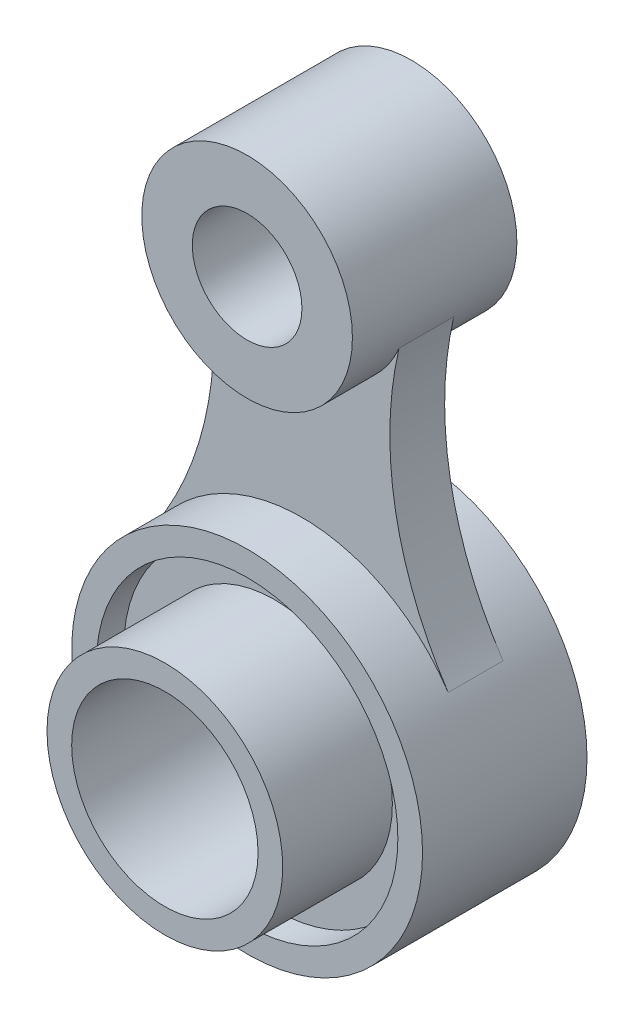
ISO-10303-21;
HEADER;
FILE_DESCRIPTION(('STEP AP214'),'2;1');
FILE_NAME('part.step','',(''),(''),'','','');
FILE_SCHEMA(('AUTOMOTIVE_DESIGN { 1 0 10303 214 1 1 1 1 }'));
ENDSEC;
DATA;
#1=APPLICATION_CONTEXT('core data for automotive mechanical design processes');
#2=APPLICATION_PROTOCOL_DEFINITION('international standard','automotive_design',2000,#1);
#3=PRODUCT_CONTEXT('',#1,'mechanical');
#4=PRODUCT('Part','Part','',(#3));
#5=PRODUCT_RELATED_PRODUCT_CATEGORY('part','',(#4));
#6=PRODUCT_DEFINITION_FORMATION('','',#4);
#7=PRODUCT_DEFINITION_CONTEXT('part definition',#1,'design');
#8=PRODUCT_DEFINITION('design','',#6,#7);
#9=PRODUCT_DEFINITION_SHAPE('','',#8);
#10=(LENGTH_UNIT() NAMED_UNIT(*) SI_UNIT(.MILLI.,.METRE.));
#11=(NAMED_UNIT(*) PLANE_ANGLE_UNIT() SI_UNIT($,.RADIAN.));
#12=(NAMED_UNIT(*) SI_UNIT($,.STERADIAN.) SOLID_ANGLE_UNIT());
#13=UNCERTAINTY_MEASURE_WITH_UNIT(LENGTH_MEASURE(1.E-05),#10,'distance_accuracy_value','');
#14=(GEOMETRIC_REPRESENTATION_CONTEXT(3) GLOBAL_UNCERTAINTY_ASSIGNED_CONTEXT((#13)) GLOBAL_UNIT_ASSIGNED_CONTEXT((#10,
#11,#12)) REPRESENTATION_CONTEXT('',''));
#15=CARTESIAN_POINT('',(0.,0.,0.));
#16=DIRECTION('',(0.,0.,1.));
#17=DIRECTION('',(1.,0.,0.));
#18=AXIS2_PLACEMENT_3D('',#15,#16,#17);
#19=CARTESIAN_POINT('',(0.,36.4063930720717,-15.));
#20=DIRECTION('',(0.,0.,1.));
#21=DIRECTION('',(1.,0.,0.));
#22=AXIS2_PLACEMENT_3D('',#19,#20,#21);
#23=CYLINDRICAL_SURFACE('',#22,19.2116819747417);
#24=DIRECTION('',(0.,0.,1.));
#25=VECTOR('',#24,1.);
#26=CARTESIAN_POINT('',(17.7067918449867,28.9526526112744,0.));
#27=LINE('',#26,#25);
#28=CARTESIAN_POINT('',(17.7067918449866,28.9526526112744,5.));
#29=VERTEX_POINT('',#28);
#30=CARTESIAN_POINT('',(17.7067918449866,28.9526526112744,-5.));
#31=VERTEX_POINT('',#30);
#32=EDGE_CURVE('E188',#29,#31,#27,.F.);
#33=ORIENTED_EDGE('',*,*,#32,.T.);
#34=CARTESIAN_POINT('',(0.,36.4063930720717,-5.));
#35=DIRECTION('',(0.,0.,-1.));
#36=DIRECTION('',(-1.,0.,0.));
#37=AXIS2_PLACEMENT_3D('',#34,#35,#36);
#38=CIRCLE('',#37,19.2116819747417);
#39=CARTESIAN_POINT('',(-17.7067918449866,28.9526526112744,-5.));
#40=VERTEX_POINT('',#39);
#41=EDGE_CURVE('E200',#31,#40,#38,.T.);
#42=ORIENTED_EDGE('',*,*,#41,.T.);
#43=DIRECTION('',(0.,0.,1.));
#44=VECTOR('',#43,1.);
#45=CARTESIAN_POINT('',(-17.7067918449867,28.9526526112744,0.));
#46=LINE('',#45,#44);
#47=CARTESIAN_POINT('',(-17.7067918449866,28.9526526112744,5.));
#48=VERTEX_POINT('',#47);
#49=EDGE_CURVE('E162',#48,#40,#46,.F.);
#50=ORIENTED_EDGE('',*,*,#49,.F.);
#51=CARTESIAN_POINT('',(0.,36.4063930720717,5.));
#52=DIRECTION('',(0.,0.,-1.));
#53=DIRECTION('',(-1.,0.,0.));
#54=AXIS2_PLACEMENT_3D('',#51,#52,#53);
#55=CIRCLE('',#54,19.2116819747417);
#56=EDGE_CURVE('E155',#29,#48,#55,.T.);
#57=ORIENTED_EDGE('',*,*,#56,.F.);
#58=EDGE_LOOP('',(#33,#42,#50,#57));
#59=FACE_BOUND('',#58,.T.);
#60=CARTESIAN_POINT('',(0.,36.4063930720717,-15.));
#61=DIRECTION('',(0.,0.,1.));
#62=DIRECTION('',(1.,0.,0.));
#63=AXIS2_PLACEMENT_3D('',#60,#61,#62);
#64=CIRCLE('',#63,19.2116819747417);
#65=CARTESIAN_POINT('',(19.2116819747417,36.4063930720717,-15.));
#66=VERTEX_POINT('',#65);
#67=EDGE_CURVE('E236',#66,#66,#64,.T.);
#68=ORIENTED_EDGE('',*,*,#67,.T.);
#69=EDGE_LOOP('',(#68));
#70=FACE_BOUND('',#69,.T.);
#71=CARTESIAN_POINT('',(0.,36.4063930720717,15.));
#72=DIRECTION('',(0.,0.,1.));
#73=DIRECTION('',(1.,0.,0.));
#74=AXIS2_PLACEMENT_3D('',#71,#72,#73);
#75=CIRCLE('',#74,19.2116819747417);
#76=CARTESIAN_POINT('',(19.2116819747417,36.4063930720717,15.));
#77=VERTEX_POINT('',#76);
#78=EDGE_CURVE('E230',#77,#77,#75,.T.);
#79=ORIENTED_EDGE('',*,*,#78,.F.);
#80=EDGE_LOOP('',(#79));
#81=FACE_BOUND('',#80,.T.);
#82=ADVANCED_FACE('F147',(#59,#70,#81),#23,.T.);
#83=CARTESIAN_POINT('',(0.,36.4063930720717,-15.));
#84=DIRECTION('',(0.,0.,1.));
#85=DIRECTION('',(1.,0.,0.));
#86=AXIS2_PLACEMENT_3D('',#83,#84,#85);
#87=PLANE('',#86);
#88=CARTESIAN_POINT('',(0.,36.4063930720717,-15.));
#89=DIRECTION('',(0.,0.,1.));
#90=DIRECTION('',(1.,0.,0.));
#91=AXIS2_PLACEMENT_3D('',#88,#89,#90);
#92=CIRCLE('',#91,10.);
#93=CARTESIAN_POINT('',(10.,36.4063930720717,-15.));
#94=VERTEX_POINT('',#93);
#95=EDGE_CURVE('E233',#94,#94,#92,.T.);
#96=ORIENTED_EDGE('',*,*,#95,.T.);
#97=EDGE_LOOP('',(#96));
#98=FACE_BOUND('',#97,.T.);
#99=ORIENTED_EDGE('',*,*,#67,.F.);
#100=EDGE_LOOP('',(#99));
#101=FACE_BOUND('',#100,.T.);
#102=ADVANCED_FACE('F275',(#98,#101),#87,.F.);
#103=CARTESIAN_POINT('',(0.,36.4063930720717,15.));
#104=DIRECTION('',(0.,0.,1.));
#105=DIRECTION('',(1.,0.,0.));
#106=AXIS2_PLACEMENT_3D('',#103,#104,#105);
#107=PLANE('',#106);
#108=ORIENTED_EDGE('',*,*,#78,.T.);
#109=EDGE_LOOP('',(#108));
#110=FACE_BOUND('',#109,.T.);
#111=CARTESIAN_POINT('',(0.,36.4063930720717,15.));
#112=DIRECTION('',(0.,0.,1.));
#113=DIRECTION('',(1.,0.,0.));
#114=AXIS2_PLACEMENT_3D('',#111,#112,#113);
#115=CIRCLE('',#114,10.);
#116=CARTESIAN_POINT('',(10.,36.4063930720717,15.));
#117=VERTEX_POINT('',#116);
#118=EDGE_CURVE('E226',#117,#117,#115,.T.);
#119=ORIENTED_EDGE('',*,*,#118,.F.);
#120=EDGE_LOOP('',(#119));
#121=FACE_BOUND('',#120,.T.);
#122=ADVANCED_FACE('F280',(#110,#121),#107,.T.);
#123=CARTESIAN_POINT('',(0.,36.4063930720717,-5.));
#124=DIRECTION('',(0.,0.,1.));
#125=DIRECTION('',(1.,0.,0.));
#126=AXIS2_PLACEMENT_3D('',#123,#124,#125);
#127=CYLINDRICAL_SURFACE('',#126,10.);
#128=ORIENTED_EDGE('',*,*,#118,.T.);
#129=EDGE_LOOP('',(#128));
#130=FACE_BOUND('',#129,.T.);
#131=ORIENTED_EDGE('',*,*,#95,.F.);
#132=EDGE_LOOP('',(#131));
#133=FACE_BOUND('',#132,.T.);
#134=ADVANCED_FACE('F289',(#130,#133),#127,.F.);
#135=CARTESIAN_POINT('',(0.,-38.5936069279283,-5.));
#136=DIRECTION('',(0.,0.,1.));
#137=DIRECTION('',(1.,0.,0.));
#138=AXIS2_PLACEMENT_3D('',#135,#136,#137);
#139=CYLINDRICAL_SURFACE('',#138,32.);
#140=DIRECTION('',(0.,0.,1.));
#141=VECTOR('',#140,1.);
#142=CARTESIAN_POINT('',(26.6783026465097,-20.9224958168172,-5.));
#143=LINE('',#142,#141);
#144=CARTESIAN_POINT('',(26.6783026465097,-20.9224958168172,-5.));
#145=VERTEX_POINT('',#144);
#146=CARTESIAN_POINT('',(26.6783026465097,-20.9224958168172,5.));
#147=VERTEX_POINT('',#146);
#148=EDGE_CURVE('E194',#145,#147,#143,.T.);
#149=ORIENTED_EDGE('',*,*,#148,.T.);
#150=CARTESIAN_POINT('',(0.,-38.5936069279283,5.));
#151=DIRECTION('',(0.,0.,-1.));
#152=DIRECTION('',(-1.,0.,0.));
#153=AXIS2_PLACEMENT_3D('',#150,#151,#152);
#154=CIRCLE('',#153,32.);
#155=CARTESIAN_POINT('',(-26.6783026465097,-20.9224958168172,5.));
#156=VERTEX_POINT('',#155);
#157=EDGE_CURVE('E12',#156,#147,#154,.T.);
#158=ORIENTED_EDGE('',*,*,#157,.F.);
#159=DIRECTION('',(0.,0.,1.));
#160=VECTOR('',#159,1.);
#161=CARTESIAN_POINT('',(-26.6783026465097,-20.9224958168172,-5.));
#162=LINE('',#161,#160);
#163=CARTESIAN_POINT('',(-26.6783026465097,-20.9224958168172,-5.));
#164=VERTEX_POINT('',#163);
#165=EDGE_CURVE('E214',#164,#156,#162,.T.);
#166=ORIENTED_EDGE('',*,*,#165,.F.);
#167=CARTESIAN_POINT('',(0.,-38.5936069279283,-5.));
#168=DIRECTION('',(0.,0.,-1.));
#169=DIRECTION('',(-1.,0.,0.));
#170=AXIS2_PLACEMENT_3D('',#167,#168,#169);
#171=CIRCLE('',#170,32.);
#172=EDGE_CURVE('E170',#164,#145,#171,.T.);
#173=ORIENTED_EDGE('',*,*,#172,.T.);
#174=EDGE_LOOP('',(#149,#158,#166,#173));
#175=FACE_BOUND('',#174,.T.);
#176=CARTESIAN_POINT('',(0.,-38.5936069279283,15.));
#177=DIRECTION('',(0.,0.,1.));
#178=DIRECTION('',(1.,0.,0.));
#179=AXIS2_PLACEMENT_3D('',#176,#177,#178);
#180=CIRCLE('',#179,32.);
#181=CARTESIAN_POINT('',(32.,-38.5936069279283,15.));
#182=VERTEX_POINT('',#181);
#183=EDGE_CURVE('E242',#182,#182,#180,.T.);
#184=ORIENTED_EDGE('',*,*,#183,.F.);
#185=EDGE_LOOP('',(#184));
#186=FACE_BOUND('',#185,.T.);
#187=CARTESIAN_POINT('',(0.,-38.5936069279283,-15.));
#188=DIRECTION('',(0.,0.,1.));
#189=DIRECTION('',(1.,0.,0.));
#190=AXIS2_PLACEMENT_3D('',#187,#188,#189);
#191=CIRCLE('',#190,32.);
#192=CARTESIAN_POINT('',(32.,-38.5936069279283,-15.));
#193=VERTEX_POINT('',#192);
#194=EDGE_CURVE('E225',#193,#193,#191,.T.);
#195=ORIENTED_EDGE('',*,*,#194,.T.);
#196=EDGE_LOOP('',(#195));
#197=FACE_BOUND('',#196,.T.);
#198=ADVANCED_FACE('F219',(#175,#186,#197),#139,.T.);
#199=CARTESIAN_POINT('',(40.0174539697645,25.4130597387384,-5.));
#200=DIRECTION('',(0.,0.,-1.));
#201=DIRECTION('',(-1.,0.,0.));
#202=AXIS2_PLACEMENT_3D('',#199,#200,#201);
#203=PLANE('',#202);
#204=ORIENTED_EDGE('',*,*,#172,.F.);
#205=CARTESIAN_POINT('',(-80.034907939529,14.419726405405,-5.));
#206=DIRECTION('',(0.,0.,1.));
#207=DIRECTION('',(1.,0.,0.));
#208=AXIS2_PLACEMENT_3D('',#205,#206,#207);
#209=CIRCLE('',#208,64.);
#210=EDGE_CURVE('E211',#164,#40,#209,.T.);
#211=ORIENTED_EDGE('',*,*,#210,.T.);
#212=ORIENTED_EDGE('',*,*,#41,.F.);
#213=CARTESIAN_POINT('',(80.034907939529,14.419726405405,-5.));
#214=DIRECTION('',(0.,0.,-1.));
#215=DIRECTION('',(-1.,0.,0.));
#216=AXIS2_PLACEMENT_3D('',#213,#214,#215);
#217=CIRCLE('',#216,64.);
#218=EDGE_CURVE('E199',#145,#31,#217,.T.);
#219=ORIENTED_EDGE('',*,*,#218,.F.);
#220=EDGE_LOOP('',(#204,#211,#212,#219));
#221=FACE_BOUND('',#220,.T.);
#222=ADVANCED_FACE('F222',(#221),#203,.T.);
#223=CARTESIAN_POINT('',(40.0174539697645,25.4130597387384,5.));
#224=DIRECTION('',(0.,0.,-1.));
#225=DIRECTION('',(-1.,0.,0.));
#226=AXIS2_PLACEMENT_3D('',#223,#224,#225);
#227=PLANE('',#226);
#228=CARTESIAN_POINT('',(-80.034907939529,14.419726405405,5.));
#229=DIRECTION('',(0.,0.,1.));
#230=DIRECTION('',(1.,0.,0.));
#231=AXIS2_PLACEMENT_3D('',#228,#229,#230);
#232=CIRCLE('',#231,64.);
#233=EDGE_CURVE('E204',#156,#48,#232,.T.);
#234=ORIENTED_EDGE('',*,*,#233,.F.);
#235=ORIENTED_EDGE('',*,*,#157,.T.);
#236=CARTESIAN_POINT('',(80.034907939529,14.419726405405,5.));
#237=DIRECTION('',(0.,0.,-1.));
#238=DIRECTION('',(-1.,0.,0.));
#239=AXIS2_PLACEMENT_3D('',#236,#237,#238);
#240=CIRCLE('',#239,64.);
#241=EDGE_CURVE('E197',#147,#29,#240,.T.);
#242=ORIENTED_EDGE('',*,*,#241,.T.);
#243=ORIENTED_EDGE('',*,*,#56,.T.);
#244=EDGE_LOOP('',(#234,#235,#242,#243));
#245=FACE_BOUND('',#244,.T.);
#246=ADVANCED_FACE('F202',(#245),#227,.F.);
#247=CARTESIAN_POINT('',(-80.034907939529,14.419726405405,-5.));
#248=DIRECTION('',(0.,0.,1.));
#249=DIRECTION('',(1.,0.,0.));
#250=AXIS2_PLACEMENT_3D('',#247,#248,#249);
#251=CYLINDRICAL_SURFACE('',#250,64.);
#252=ORIENTED_EDGE('',*,*,#233,.T.);
#253=ORIENTED_EDGE('',*,*,#49,.T.);
#254=ORIENTED_EDGE('',*,*,#210,.F.);
#255=ORIENTED_EDGE('',*,*,#165,.T.);
#256=EDGE_LOOP('',(#252,#253,#254,#255));
#257=FACE_BOUND('',#256,.T.);
#258=ADVANCED_FACE('F218',(#257),#251,.F.);
#259=CARTESIAN_POINT('',(80.034907939529,14.419726405405,-5.));
#260=DIRECTION('',(0.,0.,1.));
#261=DIRECTION('',(1.,0.,0.));
#262=AXIS2_PLACEMENT_3D('',#259,#260,#261);
#263=CYLINDRICAL_SURFACE('',#262,64.);
#264=ORIENTED_EDGE('',*,*,#32,.F.);
#265=ORIENTED_EDGE('',*,*,#241,.F.);
#266=ORIENTED_EDGE('',*,*,#148,.F.);
#267=ORIENTED_EDGE('',*,*,#218,.T.);
#268=EDGE_LOOP('',(#264,#265,#266,#267));
#269=FACE_BOUND('',#268,.T.);
#270=ADVANCED_FACE('F149',(#269),#263,.F.);
#271=CARTESIAN_POINT('',(0.,-38.5936069279283,15.));
#272=DIRECTION('',(0.,0.,1.));
#273=DIRECTION('',(1.,0.,0.));
#274=AXIS2_PLACEMENT_3D('',#271,#272,#273);
#275=PLANE('',#274);
#276=ORIENTED_EDGE('',*,*,#183,.T.);
#277=EDGE_LOOP('',(#276));
#278=FACE_BOUND('',#277,.T.);
#279=CARTESIAN_POINT('',(0.,-38.5936069279283,15.));
#280=DIRECTION('',(0.,0.,1.));
#281=DIRECTION('',(1.,0.,0.));
#282=AXIS2_PLACEMENT_3D('',#279,#280,#281);
#283=CIRCLE('',#282,27.5);
#284=CARTESIAN_POINT('',(27.5,-38.5936069279283,15.));
#285=VERTEX_POINT('',#284);
#286=EDGE_CURVE('E229',#285,#285,#283,.T.);
#287=ORIENTED_EDGE('',*,*,#286,.F.);
#288=EDGE_LOOP('',(#287));
#289=FACE_BOUND('',#288,.T.);
#290=ADVANCED_FACE('F308',(#278,#289),#275,.T.);
#291=CARTESIAN_POINT('',(0.,-38.5936069279283,-15.));
#292=DIRECTION('',(0.,0.,1.));
#293=DIRECTION('',(1.,0.,0.));
#294=AXIS2_PLACEMENT_3D('',#291,#292,#293);
#295=PLANE('',#294);
#296=ORIENTED_EDGE('',*,*,#194,.F.);
#297=EDGE_LOOP('',(#296));
#298=FACE_BOUND('',#297,.T.);
#299=CARTESIAN_POINT('',(0.,-38.5936069279283,-15.));
#300=DIRECTION('',(0.,0.,1.));
#301=DIRECTION('',(1.,0.,0.));
#302=AXIS2_PLACEMENT_3D('',#299,#300,#301);
#303=CIRCLE('',#302,17.);
#304=CARTESIAN_POINT('',(17.,-38.5936069279283,-15.));
#305=VERTEX_POINT('',#304);
#306=EDGE_CURVE('E252',#305,#305,#303,.T.);
#307=ORIENTED_EDGE('',*,*,#306,.T.);
#308=EDGE_LOOP('',(#307));
#309=FACE_BOUND('',#308,.T.);
#310=ADVANCED_FACE('F284',(#298,#309),#295,.F.);
#311=CARTESIAN_POINT('',(0.,-38.5936069279283,-5.));
#312=DIRECTION('',(0.,0.,1.));
#313=DIRECTION('',(1.,0.,0.));
#314=AXIS2_PLACEMENT_3D('',#311,#312,#313);
#315=CYLINDRICAL_SURFACE('',#314,27.5);
#316=CARTESIAN_POINT('',(0.,-38.5936069279283,10.));
#317=DIRECTION('',(0.,0.,1.));
#318=DIRECTION('',(1.,0.,0.));
#319=AXIS2_PLACEMENT_3D('',#316,#317,#318);
#320=CIRCLE('',#319,27.5);
#321=CARTESIAN_POINT('',(27.5,-38.5936069279283,10.));
#322=VERTEX_POINT('',#321);
#323=EDGE_CURVE('E239',#322,#322,#320,.T.);
#324=ORIENTED_EDGE('',*,*,#323,.F.);
#325=EDGE_LOOP('',(#324));
#326=FACE_BOUND('',#325,.T.);
#327=ORIENTED_EDGE('',*,*,#286,.T.);
#328=EDGE_LOOP('',(#327));
#329=FACE_BOUND('',#328,.T.);
#330=ADVANCED_FACE('F296',(#326,#329),#315,.F.);
#331=CARTESIAN_POINT('',(0.,-38.5936069279283,10.));
#332=DIRECTION('',(0.,0.,1.));
#333=DIRECTION('',(1.,0.,0.));
#334=AXIS2_PLACEMENT_3D('',#331,#332,#333);
#335=PLANE('',#334);
#336=ORIENTED_EDGE('',*,*,#323,.T.);
#337=EDGE_LOOP('',(#336));
#338=FACE_BOUND('',#337,.T.);
#339=CARTESIAN_POINT('',(0.,-38.5936069279283,10.));
#340=DIRECTION('',(0.,0.,1.));
#341=DIRECTION('',(1.,0.,0.));
#342=AXIS2_PLACEMENT_3D('',#339,#340,#341);
#343=CIRCLE('',#342,21.5);
#344=CARTESIAN_POINT('',(21.5,-38.5936069279283,10.));
#345=VERTEX_POINT('',#344);
#346=EDGE_CURVE('E249',#345,#345,#343,.T.);
#347=ORIENTED_EDGE('',*,*,#346,.F.);
#348=EDGE_LOOP('',(#347));
#349=FACE_BOUND('',#348,.T.);
#350=ADVANCED_FACE('F299',(#338,#349),#335,.T.);
#351=CARTESIAN_POINT('',(0.,-38.5936069279283,-15.));
#352=DIRECTION('',(0.,0.,1.));
#353=DIRECTION('',(1.,0.,0.));
#354=AXIS2_PLACEMENT_3D('',#351,#352,#353);
#355=CYLINDRICAL_SURFACE('',#354,21.5);
#356=ORIENTED_EDGE('',*,*,#346,.T.);
#357=EDGE_LOOP('',(#356));
#358=FACE_BOUND('',#357,.T.);
#359=CARTESIAN_POINT('',(0.,-38.5936069279283,30.));
#360=DIRECTION('',(0.,0.,1.));
#361=DIRECTION('',(1.,0.,0.));
#362=AXIS2_PLACEMENT_3D('',#359,#360,#361);
#363=CIRCLE('',#362,21.5);
#364=CARTESIAN_POINT('',(21.5,-38.5936069279283,30.));
#365=VERTEX_POINT('',#364);
#366=EDGE_CURVE('E255',#365,#365,#363,.T.);
#367=ORIENTED_EDGE('',*,*,#366,.F.);
#368=EDGE_LOOP('',(#367));
#369=FACE_BOUND('',#368,.T.);
#370=ADVANCED_FACE('F271',(#358,#369),#355,.T.);
#371=CARTESIAN_POINT('',(0.,-38.5936069279283,-15.));
#372=DIRECTION('',(0.,0.,1.));
#373=DIRECTION('',(1.,0.,0.));
#374=AXIS2_PLACEMENT_3D('',#371,#372,#373);
#375=CYLINDRICAL_SURFACE('',#374,17.);
#376=ORIENTED_EDGE('',*,*,#306,.F.);
#377=EDGE_LOOP('',(#376));
#378=FACE_BOUND('',#377,.T.);
#379=CARTESIAN_POINT('',(0.,-38.5936069279283,30.));
#380=DIRECTION('',(0.,0.,1.));
#381=DIRECTION('',(1.,0.,0.));
#382=AXIS2_PLACEMENT_3D('',#379,#380,#381);
#383=CIRCLE('',#382,17.);
#384=CARTESIAN_POINT('',(17.,-38.5936069279283,30.));
#385=VERTEX_POINT('',#384);
#386=EDGE_CURVE('E258',#385,#385,#383,.T.);
#387=ORIENTED_EDGE('',*,*,#386,.T.);
#388=EDGE_LOOP('',(#387));
#389=FACE_BOUND('',#388,.T.);
#390=ADVANCED_FACE('F262',(#378,#389),#375,.F.);
#391=CARTESIAN_POINT('',(0.,-38.5936069279283,30.));
#392=DIRECTION('',(0.,0.,1.));
#393=DIRECTION('',(1.,0.,0.));
#394=AXIS2_PLACEMENT_3D('',#391,#392,#393);
#395=PLANE('',#394);
#396=ORIENTED_EDGE('',*,*,#366,.T.);
#397=EDGE_LOOP('',(#396));
#398=FACE_BOUND('',#397,.T.);
#399=ORIENTED_EDGE('',*,*,#386,.F.);
#400=EDGE_LOOP('',(#399));
#401=FACE_BOUND('',#400,.T.);
#402=ADVANCED_FACE('F264',(#398,#401),#395,.T.);
#403=CLOSED_SHELL('',(#82,#102,#122,#134,#198,#222,#246,#258,#270,#290,#310,#330,#350,#370,#390,#402));
#404=MANIFOLD_SOLID_BREP('B2',#403);
#405=ADVANCED_BREP_SHAPE_REPRESENTATION('',(#18,#404),#14);
#406=SHAPE_DEFINITION_REPRESENTATION(#9,#405);
ENDSEC;
END-ISO-10303-21;
